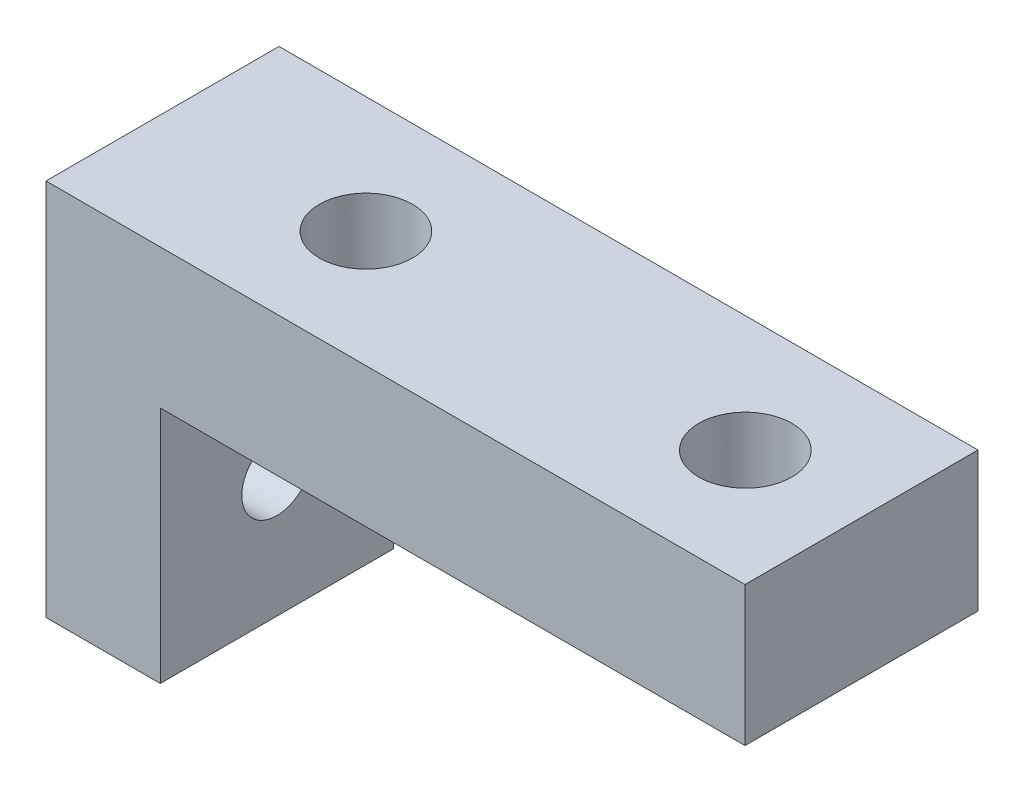
ISO-10303-21;
HEADER;
FILE_DESCRIPTION(('STEP AP214'),'2;1');
FILE_NAME('part.step','',(''),(''),'','','');
FILE_SCHEMA(('AUTOMOTIVE_DESIGN { 1 0 10303 214 1 1 1 1 }'));
ENDSEC;
DATA;
#1=APPLICATION_CONTEXT('core data for automotive mechanical design processes');
#2=APPLICATION_PROTOCOL_DEFINITION('international standard','automotive_design',2000,#1);
#3=PRODUCT_CONTEXT('',#1,'mechanical');
#4=PRODUCT('Part','Part','',(#3));
#5=PRODUCT_RELATED_PRODUCT_CATEGORY('part','',(#4));
#6=PRODUCT_DEFINITION_FORMATION('','',#4);
#7=PRODUCT_DEFINITION_CONTEXT('part definition',#1,'design');
#8=PRODUCT_DEFINITION('design','',#6,#7);
#9=PRODUCT_DEFINITION_SHAPE('','',#8);
#10=(LENGTH_UNIT() NAMED_UNIT(*) SI_UNIT(.MILLI.,.METRE.));
#11=(NAMED_UNIT(*) PLANE_ANGLE_UNIT() SI_UNIT($,.RADIAN.));
#12=(NAMED_UNIT(*) SI_UNIT($,.STERADIAN.) SOLID_ANGLE_UNIT());
#13=UNCERTAINTY_MEASURE_WITH_UNIT(LENGTH_MEASURE(1.E-05),#10,'distance_accuracy_value','');
#14=(GEOMETRIC_REPRESENTATION_CONTEXT(3) GLOBAL_UNCERTAINTY_ASSIGNED_CONTEXT((#13)) GLOBAL_UNIT_ASSIGNED_CONTEXT((#10,
#11,#12)) REPRESENTATION_CONTEXT('',''));
#15=CARTESIAN_POINT('',(0.,0.,0.));
#16=DIRECTION('',(0.,0.,1.));
#17=DIRECTION('',(1.,0.,0.));
#18=AXIS2_PLACEMENT_3D('',#15,#16,#17);
#19=CARTESIAN_POINT('',(-54.7355769230769,-16.2259615384615,10.));
#20=DIRECTION('',(1.,0.,0.));
#21=DIRECTION('',(0.,0.,-1.));
#22=AXIS2_PLACEMENT_3D('',#19,#20,#21);
#23=PLANE('',#22);
#24=CARTESIAN_POINT('',(-54.7355769230769,-10.9901152310876,5.));
#25=DIRECTION('',(1.,0.,0.));
#26=DIRECTION('',(0.,0.,-1.));
#27=AXIS2_PLACEMENT_3D('',#24,#25,#26);
#28=CIRCLE('',#27,1.5);
#29=CARTESIAN_POINT('',(-54.7355769230769,-10.9901152310876,6.5));
#30=VERTEX_POINT('',#29);
#31=EDGE_CURVE('E138',#30,#30,#28,.T.);
#32=ORIENTED_EDGE('',*,*,#31,.T.);
#33=EDGE_LOOP('',(#32));
#34=FACE_BOUND('',#33,.T.);
#35=DIRECTION('',(0.,-1.,0.));
#36=VECTOR('',#35,1.);
#37=CARTESIAN_POINT('',(-54.7355769230769,-16.2259615384615,0.));
#38=LINE('',#37,#36);
#39=CARTESIAN_POINT('',(-54.7355769230769,0.,0.));
#40=VERTEX_POINT('',#39);
#41=CARTESIAN_POINT('',(-54.7355769230769,-16.2259615384615,0.));
#42=VERTEX_POINT('',#41);
#43=EDGE_CURVE('E133',#40,#42,#38,.T.);
#44=ORIENTED_EDGE('',*,*,#43,.T.);
#45=DIRECTION('',(0.,0.,-1.));
#46=VECTOR('',#45,1.);
#47=CARTESIAN_POINT('',(-54.7355769230769,-16.2259615384615,10.));
#48=LINE('',#47,#46);
#49=CARTESIAN_POINT('',(-54.7355769230769,-16.2259615384615,10.));
#50=VERTEX_POINT('',#49);
#51=EDGE_CURVE('E11',#50,#42,#48,.T.);
#52=ORIENTED_EDGE('',*,*,#51,.F.);
#53=DIRECTION('',(0.,-1.,0.));
#54=VECTOR('',#53,1.);
#55=CARTESIAN_POINT('',(-54.7355769230769,-16.2259615384615,10.));
#56=LINE('',#55,#54);
#57=CARTESIAN_POINT('',(-54.7355769230769,0.,10.));
#58=VERTEX_POINT('',#57);
#59=EDGE_CURVE('E150',#58,#50,#56,.T.);
#60=ORIENTED_EDGE('',*,*,#59,.F.);
#61=DIRECTION('',(0.,0.,-1.));
#62=VECTOR('',#61,1.);
#63=CARTESIAN_POINT('',(-54.7355769230769,0.,10.));
#64=LINE('',#63,#62);
#65=EDGE_CURVE('E129',#58,#40,#64,.T.);
#66=ORIENTED_EDGE('',*,*,#65,.T.);
#67=EDGE_LOOP('',(#44,#52,#60,#66));
#68=FACE_BOUND('',#67,.T.);
#69=ADVANCED_FACE('F42',(#34,#68),#23,.F.);
#70=CARTESIAN_POINT('',(-49.8317307692308,-16.2259615384615,10.));
#71=DIRECTION('',(0.,1.,0.));
#72=DIRECTION('',(0.,0.,1.));
#73=AXIS2_PLACEMENT_3D('',#70,#71,#72);
#74=PLANE('',#73);
#75=DIRECTION('',(1.,0.,0.));
#76=VECTOR('',#75,1.);
#77=CARTESIAN_POINT('',(-49.8317307692308,-16.2259615384615,0.));
#78=LINE('',#77,#76);
#79=CARTESIAN_POINT('',(-49.8317307692308,-16.2259615384615,0.));
#80=VERTEX_POINT('',#79);
#81=EDGE_CURVE('E137',#42,#80,#78,.T.);
#82=ORIENTED_EDGE('',*,*,#81,.T.);
#83=DIRECTION('',(0.,0.,-1.));
#84=VECTOR('',#83,1.);
#85=CARTESIAN_POINT('',(-49.8317307692308,-16.2259615384615,10.));
#86=LINE('',#85,#84);
#87=CARTESIAN_POINT('',(-49.8317307692308,-16.2259615384615,10.));
#88=VERTEX_POINT('',#87);
#89=EDGE_CURVE('E52',#88,#80,#86,.T.);
#90=ORIENTED_EDGE('',*,*,#89,.F.);
#91=DIRECTION('',(1.,0.,0.));
#92=VECTOR('',#91,1.);
#93=CARTESIAN_POINT('',(-49.8317307692308,-16.2259615384615,10.));
#94=LINE('',#93,#92);
#95=EDGE_CURVE('E98',#50,#88,#94,.T.);
#96=ORIENTED_EDGE('',*,*,#95,.F.);
#97=ORIENTED_EDGE('',*,*,#51,.T.);
#98=EDGE_LOOP('',(#82,#90,#96,#97));
#99=FACE_BOUND('',#98,.T.);
#100=ADVANCED_FACE('F190',(#99),#74,.F.);
#101=CARTESIAN_POINT('',(-49.8317307692308,-5.98557692307693,10.));
#102=DIRECTION('',(-1.,0.,0.));
#103=DIRECTION('',(0.,0.,1.));
#104=AXIS2_PLACEMENT_3D('',#101,#102,#103);
#105=PLANE('',#104);
#106=CARTESIAN_POINT('',(-49.8317307692308,-10.9901152310876,5.));
#107=DIRECTION('',(-1.,0.,0.));
#108=DIRECTION('',(0.,0.,1.));
#109=AXIS2_PLACEMENT_3D('',#106,#107,#108);
#110=CIRCLE('',#109,1.5);
#111=CARTESIAN_POINT('',(-49.8317307692307,-10.9901152310876,6.5));
#112=VERTEX_POINT('',#111);
#113=EDGE_CURVE('E160',#112,#112,#110,.T.);
#114=ORIENTED_EDGE('',*,*,#113,.T.);
#115=EDGE_LOOP('',(#114));
#116=FACE_BOUND('',#115,.T.);
#117=DIRECTION('',(0.,1.,0.));
#118=VECTOR('',#117,1.);
#119=CARTESIAN_POINT('',(-49.8317307692308,-5.98557692307693,0.));
#120=LINE('',#119,#118);
#121=CARTESIAN_POINT('',(-49.8317307692308,-5.98557692307693,0.));
#122=VERTEX_POINT('',#121);
#123=EDGE_CURVE('E141',#80,#122,#120,.T.);
#124=ORIENTED_EDGE('',*,*,#123,.T.);
#125=DIRECTION('',(0.,0.,-1.));
#126=VECTOR('',#125,1.);
#127=CARTESIAN_POINT('',(-49.8317307692308,-5.98557692307693,10.));
#128=LINE('',#127,#126);
#129=CARTESIAN_POINT('',(-49.8317307692308,-5.98557692307693,10.));
#130=VERTEX_POINT('',#129);
#131=EDGE_CURVE('E122',#130,#122,#128,.T.);
#132=ORIENTED_EDGE('',*,*,#131,.F.);
#133=DIRECTION('',(0.,1.,0.));
#134=VECTOR('',#133,1.);
#135=CARTESIAN_POINT('',(-49.8317307692308,-5.98557692307693,10.));
#136=LINE('',#135,#134);
#137=EDGE_CURVE('E111',#88,#130,#136,.T.);
#138=ORIENTED_EDGE('',*,*,#137,.F.);
#139=ORIENTED_EDGE('',*,*,#89,.T.);
#140=EDGE_LOOP('',(#124,#132,#138,#139));
#141=FACE_BOUND('',#140,.T.);
#142=ADVANCED_FACE('F193',(#116,#141),#105,.F.);
#143=CARTESIAN_POINT('',(-24.7355769230769,-5.98557692307693,10.));
#144=DIRECTION('',(0.,1.,0.));
#145=DIRECTION('',(0.,0.,1.));
#146=AXIS2_PLACEMENT_3D('',#143,#144,#145);
#147=PLANE('',#146);
#148=CARTESIAN_POINT('',(-46.0039250480786,-5.98557692307693,5.));
#149=DIRECTION('',(0.,1.,0.));
#150=DIRECTION('',(0.,0.,1.));
#151=AXIS2_PLACEMENT_3D('',#148,#149,#150);
#152=CIRCLE('',#151,2.);
#153=CARTESIAN_POINT('',(-46.0039250480786,-5.98557692307693,7.));
#154=VERTEX_POINT('',#153);
#155=EDGE_CURVE('E163',#154,#154,#152,.T.);
#156=ORIENTED_EDGE('',*,*,#155,.T.);
#157=EDGE_LOOP('',(#156));
#158=FACE_BOUND('',#157,.T.);
#159=CARTESIAN_POINT('',(-29.7215313874015,-5.98557692307693,5.));
#160=DIRECTION('',(0.,1.,0.));
#161=DIRECTION('',(0.,0.,1.));
#162=AXIS2_PLACEMENT_3D('',#159,#160,#161);
#163=CIRCLE('',#162,2.);
#164=CARTESIAN_POINT('',(-29.7215313874015,-5.98557692307693,7.));
#165=VERTEX_POINT('',#164);
#166=EDGE_CURVE('E167',#165,#165,#163,.T.);
#167=ORIENTED_EDGE('',*,*,#166,.T.);
#168=EDGE_LOOP('',(#167));
#169=FACE_BOUND('',#168,.T.);
#170=DIRECTION('',(1.,0.,0.));
#171=VECTOR('',#170,1.);
#172=CARTESIAN_POINT('',(-24.7355769230769,-5.98557692307693,0.));
#173=LINE('',#172,#171);
#174=CARTESIAN_POINT('',(-24.7355769230769,-5.98557692307693,0.));
#175=VERTEX_POINT('',#174);
#176=EDGE_CURVE('E120',#122,#175,#173,.T.);
#177=ORIENTED_EDGE('',*,*,#176,.T.);
#178=DIRECTION('',(0.,0.,-1.));
#179=VECTOR('',#178,1.);
#180=CARTESIAN_POINT('',(-24.7355769230769,-5.98557692307693,10.));
#181=LINE('',#180,#179);
#182=CARTESIAN_POINT('',(-24.7355769230769,-5.98557692307693,10.));
#183=VERTEX_POINT('',#182);
#184=EDGE_CURVE('E117',#183,#175,#181,.T.);
#185=ORIENTED_EDGE('',*,*,#184,.F.);
#186=DIRECTION('',(1.,0.,0.));
#187=VECTOR('',#186,1.);
#188=CARTESIAN_POINT('',(-24.7355769230769,-5.98557692307693,10.));
#189=LINE('',#188,#187);
#190=EDGE_CURVE('E105',#130,#183,#189,.T.);
#191=ORIENTED_EDGE('',*,*,#190,.F.);
#192=ORIENTED_EDGE('',*,*,#131,.T.);
#193=EDGE_LOOP('',(#177,#185,#191,#192));
#194=FACE_BOUND('',#193,.T.);
#195=ADVANCED_FACE('F118',(#158,#169,#194),#147,.F.);
#196=CARTESIAN_POINT('',(-24.7355769230769,0.,10.));
#197=DIRECTION('',(-1.,0.,0.));
#198=DIRECTION('',(0.,0.,1.));
#199=AXIS2_PLACEMENT_3D('',#196,#197,#198);
#200=PLANE('',#199);
#201=DIRECTION('',(0.,1.,0.));
#202=VECTOR('',#201,1.);
#203=CARTESIAN_POINT('',(-24.7355769230769,0.,0.));
#204=LINE('',#203,#202);
#205=CARTESIAN_POINT('',(-24.7355769230769,0.,0.));
#206=VERTEX_POINT('',#205);
#207=EDGE_CURVE('E84',#175,#206,#204,.T.);
#208=ORIENTED_EDGE('',*,*,#207,.T.);
#209=DIRECTION('',(0.,0.,-1.));
#210=VECTOR('',#209,1.);
#211=CARTESIAN_POINT('',(-24.7355769230769,0.,10.));
#212=LINE('',#211,#210);
#213=CARTESIAN_POINT('',(-24.7355769230769,0.,10.));
#214=VERTEX_POINT('',#213);
#215=EDGE_CURVE('E123',#214,#206,#212,.T.);
#216=ORIENTED_EDGE('',*,*,#215,.F.);
#217=DIRECTION('',(0.,1.,0.));
#218=VECTOR('',#217,1.);
#219=CARTESIAN_POINT('',(-24.7355769230769,0.,10.));
#220=LINE('',#219,#218);
#221=EDGE_CURVE('E109',#183,#214,#220,.T.);
#222=ORIENTED_EDGE('',*,*,#221,.F.);
#223=ORIENTED_EDGE('',*,*,#184,.T.);
#224=EDGE_LOOP('',(#208,#216,#222,#223));
#225=FACE_BOUND('',#224,.T.);
#226=ADVANCED_FACE('F125',(#225),#200,.F.);
#227=CARTESIAN_POINT('',(-54.7355769230769,0.,10.));
#228=DIRECTION('',(0.,-1.,0.));
#229=DIRECTION('',(0.,0.,-1.));
#230=AXIS2_PLACEMENT_3D('',#227,#228,#229);
#231=PLANE('',#230);
#232=CARTESIAN_POINT('',(-46.0039250480786,0.,5.));
#233=DIRECTION('',(0.,-1.,0.));
#234=DIRECTION('',(0.,0.,-1.));
#235=AXIS2_PLACEMENT_3D('',#232,#233,#234);
#236=CIRCLE('',#235,2.);
#237=CARTESIAN_POINT('',(-46.0039250480786,0.,3.));
#238=VERTEX_POINT('',#237);
#239=EDGE_CURVE('E45',#238,#238,#236,.T.);
#240=ORIENTED_EDGE('',*,*,#239,.T.);
#241=EDGE_LOOP('',(#240));
#242=FACE_BOUND('',#241,.T.);
#243=CARTESIAN_POINT('',(-29.7215313874015,0.,5.));
#244=DIRECTION('',(0.,-1.,0.));
#245=DIRECTION('',(0.,0.,-1.));
#246=AXIS2_PLACEMENT_3D('',#243,#244,#245);
#247=CIRCLE('',#246,2.);
#248=CARTESIAN_POINT('',(-29.7215313874015,0.,3.));
#249=VERTEX_POINT('',#248);
#250=EDGE_CURVE('E164',#249,#249,#247,.T.);
#251=ORIENTED_EDGE('',*,*,#250,.T.);
#252=EDGE_LOOP('',(#251));
#253=FACE_BOUND('',#252,.T.);
#254=DIRECTION('',(-1.,0.,0.));
#255=VECTOR('',#254,1.);
#256=CARTESIAN_POINT('',(-54.7355769230769,0.,0.));
#257=LINE('',#256,#255);
#258=EDGE_CURVE('E90',#206,#40,#257,.T.);
#259=ORIENTED_EDGE('',*,*,#258,.T.);
#260=ORIENTED_EDGE('',*,*,#65,.F.);
#261=DIRECTION('',(-1.,0.,0.));
#262=VECTOR('',#261,1.);
#263=CARTESIAN_POINT('',(-54.7355769230769,0.,10.));
#264=LINE('',#263,#262);
#265=EDGE_CURVE('E61',#214,#58,#264,.T.);
#266=ORIENTED_EDGE('',*,*,#265,.F.);
#267=ORIENTED_EDGE('',*,*,#215,.T.);
#268=EDGE_LOOP('',(#259,#260,#266,#267));
#269=FACE_BOUND('',#268,.T.);
#270=ADVANCED_FACE('F198',(#242,#253,#269),#231,.F.);
#271=CARTESIAN_POINT('',(0.,0.,10.));
#272=DIRECTION('',(0.,0.,-1.));
#273=DIRECTION('',(-1.,0.,0.));
#274=AXIS2_PLACEMENT_3D('',#271,#272,#273);
#275=PLANE('',#274);
#276=ORIENTED_EDGE('',*,*,#59,.T.);
#277=ORIENTED_EDGE('',*,*,#95,.T.);
#278=ORIENTED_EDGE('',*,*,#137,.T.);
#279=ORIENTED_EDGE('',*,*,#190,.T.);
#280=ORIENTED_EDGE('',*,*,#221,.T.);
#281=ORIENTED_EDGE('',*,*,#265,.T.);
#282=EDGE_LOOP('',(#276,#277,#278,#279,#280,#281));
#283=FACE_BOUND('',#282,.T.);
#284=ADVANCED_FACE('F107',(#283),#275,.F.);
#285=CARTESIAN_POINT('',(0.,0.,0.));
#286=DIRECTION('',(0.,0.,-1.));
#287=DIRECTION('',(-1.,0.,0.));
#288=AXIS2_PLACEMENT_3D('',#285,#286,#287);
#289=PLANE('',#288);
#290=ORIENTED_EDGE('',*,*,#43,.F.);
#291=ORIENTED_EDGE('',*,*,#258,.F.);
#292=ORIENTED_EDGE('',*,*,#207,.F.);
#293=ORIENTED_EDGE('',*,*,#176,.F.);
#294=ORIENTED_EDGE('',*,*,#123,.F.);
#295=ORIENTED_EDGE('',*,*,#81,.F.);
#296=EDGE_LOOP('',(#290,#291,#292,#293,#294,#295));
#297=FACE_BOUND('',#296,.T.);
#298=ADVANCED_FACE('F196',(#297),#289,.T.);
#299=CARTESIAN_POINT('',(-24.7355769230769,-10.9901152310876,5.));
#300=DIRECTION('',(-1.,0.,0.));
#301=DIRECTION('',(0.,0.,1.));
#302=AXIS2_PLACEMENT_3D('',#299,#300,#301);
#303=CYLINDRICAL_SURFACE('',#302,1.5);
#304=CARTESIAN_POINT('',(-49.8317307692307,-10.9901152310876,6.5));
#305=CARTESIAN_POINT('',(-49.8828125,-10.9901152310876,6.5));
#306=CARTESIAN_POINT('',(-49.9338942307692,-10.9901152310876,6.5));
#307=CARTESIAN_POINT('',(-50.0360576923077,-10.9901152310876,6.5));
#308=CARTESIAN_POINT('',(-50.0871394230769,-10.9901152310876,6.5));
#309=CARTESIAN_POINT('',(-50.1893028846154,-10.9901152310876,6.5));
#310=CARTESIAN_POINT('',(-50.2403846153846,-10.9901152310876,6.5));
#311=CARTESIAN_POINT('',(-50.3425480769231,-10.9901152310876,6.5));
#312=CARTESIAN_POINT('',(-50.3936298076923,-10.9901152310876,6.5));
#313=CARTESIAN_POINT('',(-50.4957932692307,-10.9901152310876,6.5));
#314=CARTESIAN_POINT('',(-50.546875,-10.9901152310876,6.5));
#315=CARTESIAN_POINT('',(-50.6490384615384,-10.9901152310876,6.5));
#316=CARTESIAN_POINT('',(-50.7001201923077,-10.9901152310876,6.5));
#317=CARTESIAN_POINT('',(-50.8022836538461,-10.9901152310876,6.5));
#318=CARTESIAN_POINT('',(-50.8533653846154,-10.9901152310876,6.5));
#319=CARTESIAN_POINT('',(-50.9555288461538,-10.9901152310876,6.5));
#320=CARTESIAN_POINT('',(-51.0066105769231,-10.9901152310876,6.5));
#321=CARTESIAN_POINT('',(-51.1087740384615,-10.9901152310876,6.5));
#322=CARTESIAN_POINT('',(-51.1598557692308,-10.9901152310876,6.5));
#323=CARTESIAN_POINT('',(-51.2620192307692,-10.9901152310876,6.5));
#324=CARTESIAN_POINT('',(-51.3131009615384,-10.9901152310876,6.5));
#325=CARTESIAN_POINT('',(-51.4152644230769,-10.9901152310876,6.5));
#326=CARTESIAN_POINT('',(-51.4663461538461,-10.9901152310876,6.5));
#327=CARTESIAN_POINT('',(-51.5685096153846,-10.9901152310876,6.5));
#328=CARTESIAN_POINT('',(-51.6195913461538,-10.9901152310876,6.5));
#329=CARTESIAN_POINT('',(-51.7217548076923,-10.9901152310876,6.5));
#330=CARTESIAN_POINT('',(-51.7728365384615,-10.9901152310876,6.5));
#331=CARTESIAN_POINT('',(-51.875,-10.9901152310876,6.5));
#332=CARTESIAN_POINT('',(-51.9260817307692,-10.9901152310876,6.5));
#333=CARTESIAN_POINT('',(-52.0282451923077,-10.9901152310876,6.5));
#334=CARTESIAN_POINT('',(-52.0793269230769,-10.9901152310876,6.5));
#335=CARTESIAN_POINT('',(-52.1814903846154,-10.9901152310876,6.5));
#336=CARTESIAN_POINT('',(-52.2325721153846,-10.9901152310876,6.5));
#337=CARTESIAN_POINT('',(-52.3347355769231,-10.9901152310876,6.5));
#338=CARTESIAN_POINT('',(-52.3858173076923,-10.9901152310876,6.5));
#339=CARTESIAN_POINT('',(-52.4879807692308,-10.9901152310876,6.5));
#340=CARTESIAN_POINT('',(-52.5390625,-10.9901152310876,6.5));
#341=CARTESIAN_POINT('',(-52.6412259615384,-10.9901152310876,6.5));
#342=CARTESIAN_POINT('',(-52.6923076923077,-10.9901152310876,6.5));
#343=CARTESIAN_POINT('',(-52.7944711538461,-10.9901152310876,6.5));
#344=CARTESIAN_POINT('',(-52.8455528846154,-10.9901152310876,6.5));
#345=CARTESIAN_POINT('',(-52.9477163461538,-10.9901152310876,6.5));
#346=CARTESIAN_POINT('',(-52.9987980769231,-10.9901152310876,6.5));
#347=CARTESIAN_POINT('',(-53.1009615384615,-10.9901152310876,6.5));
#348=CARTESIAN_POINT('',(-53.1520432692308,-10.9901152310876,6.5));
#349=CARTESIAN_POINT('',(-53.2542067307692,-10.9901152310876,6.5));
#350=CARTESIAN_POINT('',(-53.3052884615384,-10.9901152310876,6.5));
#351=CARTESIAN_POINT('',(-53.4074519230769,-10.9901152310876,6.5));
#352=CARTESIAN_POINT('',(-53.4585336538461,-10.9901152310876,6.5));
#353=CARTESIAN_POINT('',(-53.5606971153846,-10.9901152310876,6.5));
#354=CARTESIAN_POINT('',(-53.6117788461538,-10.9901152310876,6.5));
#355=CARTESIAN_POINT('',(-53.7139423076923,-10.9901152310876,6.5));
#356=CARTESIAN_POINT('',(-53.7650240384615,-10.9901152310876,6.5));
#357=CARTESIAN_POINT('',(-53.8671875,-10.9901152310876,6.5));
#358=CARTESIAN_POINT('',(-53.9182692307692,-10.9901152310876,6.5));
#359=CARTESIAN_POINT('',(-54.0204326923077,-10.9901152310876,6.5));
#360=CARTESIAN_POINT('',(-54.0715144230769,-10.9901152310876,6.5));
#361=CARTESIAN_POINT('',(-54.1736778846154,-10.9901152310876,6.5));
#362=CARTESIAN_POINT('',(-54.2247596153846,-10.9901152310876,6.5));
#363=CARTESIAN_POINT('',(-54.3269230769231,-10.9901152310876,6.5));
#364=CARTESIAN_POINT('',(-54.3780048076923,-10.9901152310876,6.5));
#365=CARTESIAN_POINT('',(-54.4801682692308,-10.9901152310876,6.5));
#366=CARTESIAN_POINT('',(-54.53125,-10.9901152310876,6.5));
#367=CARTESIAN_POINT('',(-54.6334134615384,-10.9901152310876,6.5));
#368=CARTESIAN_POINT('',(-54.6844951923077,-10.9901152310876,6.5));
#369=CARTESIAN_POINT('',(-54.7355769230769,-10.9901152310876,6.5));
#370=B_SPLINE_CURVE_WITH_KNOTS('',3,(#304,#305,#306,#307,#308,#309,#310,#311,#312,#313,#314,
#315,#316,#317,#318,#319,#320,#321,#322,#323,#324,#325,#326,#327,#328,#329,#330,#331,#332,#333,
#334,#335,#336,#337,#338,#339,#340,#341,#342,#343,#344,#345,#346,#347,#348,#349,#350,#351,#352,
#353,#354,#355,#356,#357,#358,#359,#360,#361,#362,#363,#364,#365,#366,#367,#368,#369),
.UNSPECIFIED.,.F.,.F.,(4,2,2,2,2,2,2,2,2,2,2,2,2,2,2,2,2,2,2,2,2,2,2,2,2,2,2,2,2,2,2,2,4),(0.,
0.153245192307694,0.306490384615381,0.459735576923075,0.612980769230768,0.766225961538462,
0.919471153846156,1.07271634615385,1.22596153846154,1.37920673076924,1.53245192307692,
1.68569711538462,1.83894230769231,1.9921875,2.14543269230769,2.29867788461539,2.45192307692308,
2.60516826923077,2.75841346153847,2.91165865384616,3.06490384615385,3.21814903846154,
3.37139423076924,3.52463942307692,3.67788461538462,3.83112980769231,3.98437500000001,
4.1376201923077,4.29086538461539,4.44411057692309,4.59735576923078,4.75060096153847,
4.90384615384616),.UNSPECIFIED.);
#371=EDGE_CURVE('BSEAM220',#112,#30,#370,.T.);
#372=ORIENTED_EDGE('',*,*,#113,.F.);
#373=ORIENTED_EDGE('',*,*,#31,.F.);
#374=ORIENTED_EDGE('',*,*,#371,.T.);
#375=ORIENTED_EDGE('',*,*,#371,.F.);
#376=EDGE_LOOP('',(#372,#374,#373,#375));
#377=FACE_BOUND('',#376,.T.);
#378=ADVANCED_FACE('F220',(#377),#303,.F.);
#379=CARTESIAN_POINT('',(-29.7215313874015,-16.2259615384615,5.));
#380=DIRECTION('',(0.,1.,0.));
#381=DIRECTION('',(0.,0.,1.));
#382=AXIS2_PLACEMENT_3D('',#379,#380,#381);
#383=CYLINDRICAL_SURFACE('',#382,2.);
#384=ORIENTED_EDGE('',*,*,#250,.F.);
#385=EDGE_LOOP('',(#384));
#386=FACE_BOUND('',#385,.T.);
#387=ORIENTED_EDGE('',*,*,#166,.F.);
#388=EDGE_LOOP('',(#387));
#389=FACE_BOUND('',#388,.T.);
#390=ADVANCED_FACE('F222',(#386,#389),#383,.F.);
#391=CARTESIAN_POINT('',(-46.0039250480786,-16.2259615384615,5.));
#392=DIRECTION('',(0.,1.,0.));
#393=DIRECTION('',(0.,0.,1.));
#394=AXIS2_PLACEMENT_3D('',#391,#392,#393);
#395=CYLINDRICAL_SURFACE('',#394,2.);
#396=ORIENTED_EDGE('',*,*,#239,.F.);
#397=EDGE_LOOP('',(#396));
#398=FACE_BOUND('',#397,.T.);
#399=ORIENTED_EDGE('',*,*,#155,.F.);
#400=EDGE_LOOP('',(#399));
#401=FACE_BOUND('',#400,.T.);
#402=ADVANCED_FACE('F229',(#398,#401),#395,.F.);
#403=CLOSED_SHELL('',(#69,#100,#142,#195,#226,#270,#284,#298,#378,#390,#402));
#404=MANIFOLD_SOLID_BREP('B2',#403);
#405=ADVANCED_BREP_SHAPE_REPRESENTATION('',(#18,#404),#14);
#406=SHAPE_DEFINITION_REPRESENTATION(#9,#405);
ENDSEC;
END-ISO-10303-21;
